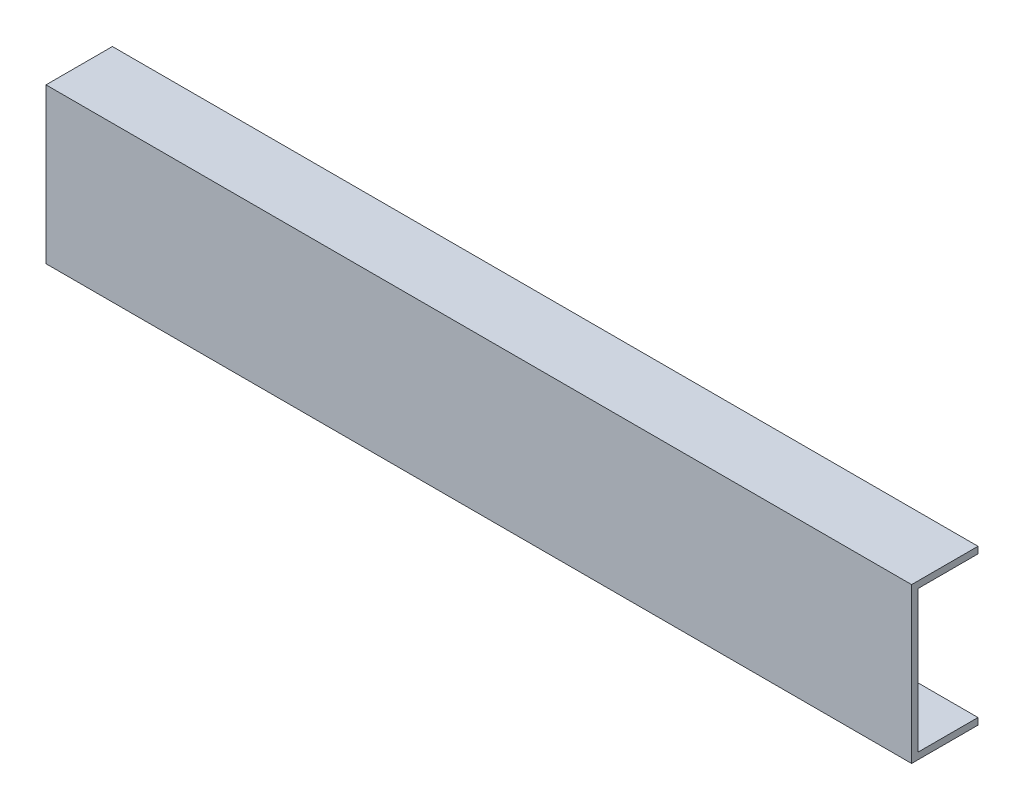
ISO-10303-21;
HEADER;
FILE_DESCRIPTION(('STEP AP214'),'2;1');
FILE_NAME('part.step','',(''),(''),'','','');
FILE_SCHEMA(('AUTOMOTIVE_DESIGN { 1 0 10303 214 1 1 1 1 }'));
ENDSEC;
DATA;
#1=APPLICATION_CONTEXT('core data for automotive mechanical design processes');
#2=APPLICATION_PROTOCOL_DEFINITION('international standard','automotive_design',2000,#1);
#3=PRODUCT_CONTEXT('',#1,'mechanical');
#4=PRODUCT('Part','Part','',(#3));
#5=PRODUCT_RELATED_PRODUCT_CATEGORY('part','',(#4));
#6=PRODUCT_DEFINITION_FORMATION('','',#4);
#7=PRODUCT_DEFINITION_CONTEXT('part definition',#1,'design');
#8=PRODUCT_DEFINITION('design','',#6,#7);
#9=PRODUCT_DEFINITION_SHAPE('','',#8);
#10=(LENGTH_UNIT() NAMED_UNIT(*) SI_UNIT(.MILLI.,.METRE.));
#11=(NAMED_UNIT(*) PLANE_ANGLE_UNIT() SI_UNIT($,.RADIAN.));
#12=(NAMED_UNIT(*) SI_UNIT($,.STERADIAN.) SOLID_ANGLE_UNIT());
#13=UNCERTAINTY_MEASURE_WITH_UNIT(LENGTH_MEASURE(1.E-05),#10,'distance_accuracy_value','');
#14=(GEOMETRIC_REPRESENTATION_CONTEXT(3) GLOBAL_UNCERTAINTY_ASSIGNED_CONTEXT((#13)) GLOBAL_UNIT_ASSIGNED_CONTEXT((#10,
#11,#12)) REPRESENTATION_CONTEXT('',''));
#15=CARTESIAN_POINT('',(0.,0.,0.));
#16=DIRECTION('',(0.,0.,1.));
#17=DIRECTION('',(1.,0.,0.));
#18=AXIS2_PLACEMENT_3D('',#15,#16,#17);
#19=CARTESIAN_POINT('',(391.08,3.,0.));
#20=DIRECTION('',(0.,0.,1.));
#21=DIRECTION('',(1.,0.,0.));
#22=AXIS2_PLACEMENT_3D('',#19,#20,#21);
#23=PLANE('',#22);
#24=DIRECTION('',(0.,1.,0.));
#25=VECTOR('',#24,1.);
#26=CARTESIAN_POINT('',(0.,3.,0.));
#27=LINE('',#26,#25);
#28=CARTESIAN_POINT('',(0.,0.,0.));
#29=VERTEX_POINT('',#28);
#30=CARTESIAN_POINT('',(0.,3.,0.));
#31=VERTEX_POINT('',#30);
#32=EDGE_CURVE('E130',#29,#31,#27,.T.);
#33=ORIENTED_EDGE('',*,*,#32,.T.);
#34=DIRECTION('',(-1.,0.,0.));
#35=VECTOR('',#34,1.);
#36=CARTESIAN_POINT('',(391.08,3.,0.));
#37=LINE('',#36,#35);
#38=CARTESIAN_POINT('',(391.08,3.,0.));
#39=VERTEX_POINT('',#38);
#40=EDGE_CURVE('E11',#39,#31,#37,.T.);
#41=ORIENTED_EDGE('',*,*,#40,.F.);
#42=DIRECTION('',(0.,1.,0.));
#43=VECTOR('',#42,1.);
#44=CARTESIAN_POINT('',(391.08,3.,0.));
#45=LINE('',#44,#43);
#46=CARTESIAN_POINT('',(391.08,0.,0.));
#47=VERTEX_POINT('',#46);
#48=EDGE_CURVE('E144',#47,#39,#45,.T.);
#49=ORIENTED_EDGE('',*,*,#48,.F.);
#50=DIRECTION('',(-1.,0.,0.));
#51=VECTOR('',#50,1.);
#52=CARTESIAN_POINT('',(391.08,0.,0.));
#53=LINE('',#52,#51);
#54=EDGE_CURVE('E126',#47,#29,#53,.T.);
#55=ORIENTED_EDGE('',*,*,#54,.T.);
#56=EDGE_LOOP('',(#33,#41,#49,#55));
#57=FACE_BOUND('',#56,.T.);
#58=ADVANCED_FACE('F34',(#57),#23,.F.);
#59=CARTESIAN_POINT('',(391.08,3.,0.));
#60=DIRECTION('',(0.,-1.,0.));
#61=DIRECTION('',(0.,0.,-1.));
#62=AXIS2_PLACEMENT_3D('',#59,#60,#61);
#63=PLANE('',#62);
#64=DIRECTION('',(0.,0.,1.));
#65=VECTOR('',#64,1.);
#66=CARTESIAN_POINT('',(0.,3.,0.));
#67=LINE('',#66,#65);
#68=CARTESIAN_POINT('',(0.,3.,27.));
#69=VERTEX_POINT('',#68);
#70=EDGE_CURVE('E133',#31,#69,#67,.T.);
#71=ORIENTED_EDGE('',*,*,#70,.T.);
#72=DIRECTION('',(-1.,0.,0.));
#73=VECTOR('',#72,1.);
#74=CARTESIAN_POINT('',(391.08,3.,27.));
#75=LINE('',#74,#73);
#76=CARTESIAN_POINT('',(391.08,3.,27.));
#77=VERTEX_POINT('',#76);
#78=EDGE_CURVE('E42',#77,#69,#75,.T.);
#79=ORIENTED_EDGE('',*,*,#78,.F.);
#80=DIRECTION('',(0.,0.,1.));
#81=VECTOR('',#80,1.);
#82=CARTESIAN_POINT('',(391.08,3.,0.));
#83=LINE('',#82,#81);
#84=EDGE_CURVE('E93',#39,#77,#83,.T.);
#85=ORIENTED_EDGE('',*,*,#84,.F.);
#86=ORIENTED_EDGE('',*,*,#40,.T.);
#87=EDGE_LOOP('',(#71,#79,#85,#86));
#88=FACE_BOUND('',#87,.T.);
#89=ADVANCED_FACE('F179',(#88),#63,.F.);
#90=CARTESIAN_POINT('',(391.08,3.,27.));
#91=DIRECTION('',(0.,0.,1.));
#92=DIRECTION('',(1.,0.,0.));
#93=AXIS2_PLACEMENT_3D('',#90,#91,#92);
#94=PLANE('',#93);
#95=DIRECTION('',(0.,1.,0.));
#96=VECTOR('',#95,1.);
#97=CARTESIAN_POINT('',(0.,3.,27.));
#98=LINE('',#97,#96);
#99=CARTESIAN_POINT('',(0.,67.,27.));
#100=VERTEX_POINT('',#99);
#101=EDGE_CURVE('E135',#69,#100,#98,.T.);
#102=ORIENTED_EDGE('',*,*,#101,.T.);
#103=DIRECTION('',(-1.,0.,0.));
#104=VECTOR('',#103,1.);
#105=CARTESIAN_POINT('',(391.08,67.,27.));
#106=LINE('',#105,#104);
#107=CARTESIAN_POINT('',(391.08,67.,27.));
#108=VERTEX_POINT('',#107);
#109=EDGE_CURVE('E151',#108,#100,#106,.T.);
#110=ORIENTED_EDGE('',*,*,#109,.F.);
#111=DIRECTION('',(0.,1.,0.));
#112=VECTOR('',#111,1.);
#113=CARTESIAN_POINT('',(391.08,3.,27.));
#114=LINE('',#113,#112);
#115=EDGE_CURVE('E159',#77,#108,#114,.T.);
#116=ORIENTED_EDGE('',*,*,#115,.F.);
#117=ORIENTED_EDGE('',*,*,#78,.T.);
#118=EDGE_LOOP('',(#102,#110,#116,#117));
#119=FACE_BOUND('',#118,.T.);
#120=ADVANCED_FACE('F157',(#119),#94,.F.);
#121=CARTESIAN_POINT('',(391.08,67.,27.));
#122=DIRECTION('',(0.,1.,0.));
#123=DIRECTION('',(0.,0.,1.));
#124=AXIS2_PLACEMENT_3D('',#121,#122,#123);
#125=PLANE('',#124);
#126=DIRECTION('',(0.,0.,-1.));
#127=VECTOR('',#126,1.);
#128=CARTESIAN_POINT('',(0.,67.,27.));
#129=LINE('',#128,#127);
#130=CARTESIAN_POINT('',(0.,67.,0.));
#131=VERTEX_POINT('',#130);
#132=EDGE_CURVE('E137',#100,#131,#129,.T.);
#133=ORIENTED_EDGE('',*,*,#132,.T.);
#134=DIRECTION('',(-1.,0.,0.));
#135=VECTOR('',#134,1.);
#136=CARTESIAN_POINT('',(391.08,67.,0.));
#137=LINE('',#136,#135);
#138=CARTESIAN_POINT('',(391.08,67.,0.));
#139=VERTEX_POINT('',#138);
#140=EDGE_CURVE('E148',#139,#131,#137,.T.);
#141=ORIENTED_EDGE('',*,*,#140,.F.);
#142=DIRECTION('',(0.,0.,-1.));
#143=VECTOR('',#142,1.);
#144=CARTESIAN_POINT('',(391.08,67.,27.));
#145=LINE('',#144,#143);
#146=EDGE_CURVE('E171',#108,#139,#145,.T.);
#147=ORIENTED_EDGE('',*,*,#146,.F.);
#148=ORIENTED_EDGE('',*,*,#109,.T.);
#149=EDGE_LOOP('',(#133,#141,#147,#148));
#150=FACE_BOUND('',#149,.T.);
#151=ADVANCED_FACE('F167',(#150),#125,.F.);
#152=CARTESIAN_POINT('',(391.08,70.,0.));
#153=DIRECTION('',(0.,0.,1.));
#154=DIRECTION('',(1.,0.,0.));
#155=AXIS2_PLACEMENT_3D('',#152,#153,#154);
#156=PLANE('',#155);
#157=DIRECTION('',(0.,1.,0.));
#158=VECTOR('',#157,1.);
#159=CARTESIAN_POINT('',(0.,70.,0.));
#160=LINE('',#159,#158);
#161=CARTESIAN_POINT('',(0.,70.,0.));
#162=VERTEX_POINT('',#161);
#163=EDGE_CURVE('E139',#131,#162,#160,.T.);
#164=ORIENTED_EDGE('',*,*,#163,.T.);
#165=DIRECTION('',(-1.,0.,0.));
#166=VECTOR('',#165,1.);
#167=CARTESIAN_POINT('',(391.08,70.,0.));
#168=LINE('',#167,#166);
#169=CARTESIAN_POINT('',(391.08,70.,0.));
#170=VERTEX_POINT('',#169);
#171=EDGE_CURVE('E121',#170,#162,#168,.T.);
#172=ORIENTED_EDGE('',*,*,#171,.F.);
#173=DIRECTION('',(0.,1.,0.));
#174=VECTOR('',#173,1.);
#175=CARTESIAN_POINT('',(391.08,70.,0.));
#176=LINE('',#175,#174);
#177=EDGE_CURVE('E112',#139,#170,#176,.T.);
#178=ORIENTED_EDGE('',*,*,#177,.F.);
#179=ORIENTED_EDGE('',*,*,#140,.T.);
#180=EDGE_LOOP('',(#164,#172,#178,#179));
#181=FACE_BOUND('',#180,.T.);
#182=ADVANCED_FACE('F170',(#181),#156,.F.);
#183=CARTESIAN_POINT('',(391.08,70.,30.));
#184=DIRECTION('',(0.,-1.,0.));
#185=DIRECTION('',(0.,0.,-1.));
#186=AXIS2_PLACEMENT_3D('',#183,#184,#185);
#187=PLANE('',#186);
#188=DIRECTION('',(0.,0.,1.));
#189=VECTOR('',#188,1.);
#190=CARTESIAN_POINT('',(0.,70.,30.));
#191=LINE('',#190,#189);
#192=CARTESIAN_POINT('',(0.,70.,30.));
#193=VERTEX_POINT('',#192);
#194=EDGE_CURVE('E120',#162,#193,#191,.T.);
#195=ORIENTED_EDGE('',*,*,#194,.T.);
#196=DIRECTION('',(-1.,0.,0.));
#197=VECTOR('',#196,1.);
#198=CARTESIAN_POINT('',(391.08,70.,30.));
#199=LINE('',#198,#197);
#200=CARTESIAN_POINT('',(391.08,70.,30.));
#201=VERTEX_POINT('',#200);
#202=EDGE_CURVE('E117',#201,#193,#199,.T.);
#203=ORIENTED_EDGE('',*,*,#202,.F.);
#204=DIRECTION('',(0.,0.,1.));
#205=VECTOR('',#204,1.);
#206=CARTESIAN_POINT('',(391.08,70.,30.));
#207=LINE('',#206,#205);
#208=EDGE_CURVE('E106',#170,#201,#207,.T.);
#209=ORIENTED_EDGE('',*,*,#208,.F.);
#210=ORIENTED_EDGE('',*,*,#171,.T.);
#211=EDGE_LOOP('',(#195,#203,#209,#210));
#212=FACE_BOUND('',#211,.T.);
#213=ADVANCED_FACE('F118',(#212),#187,.F.);
#214=CARTESIAN_POINT('',(391.08,0.,30.));
#215=DIRECTION('',(0.,0.,-1.));
#216=DIRECTION('',(-1.,0.,0.));
#217=AXIS2_PLACEMENT_3D('',#214,#215,#216);
#218=PLANE('',#217);
#219=DIRECTION('',(0.,-1.,0.));
#220=VECTOR('',#219,1.);
#221=CARTESIAN_POINT('',(0.,0.,30.));
#222=LINE('',#221,#220);
#223=CARTESIAN_POINT('',(0.,0.,30.));
#224=VERTEX_POINT('',#223);
#225=EDGE_CURVE('E79',#193,#224,#222,.T.);
#226=ORIENTED_EDGE('',*,*,#225,.T.);
#227=DIRECTION('',(-1.,0.,0.));
#228=VECTOR('',#227,1.);
#229=CARTESIAN_POINT('',(391.08,0.,30.));
#230=LINE('',#229,#228);
#231=CARTESIAN_POINT('',(391.08,0.,30.));
#232=VERTEX_POINT('',#231);
#233=EDGE_CURVE('E122',#232,#224,#230,.T.);
#234=ORIENTED_EDGE('',*,*,#233,.F.);
#235=DIRECTION('',(0.,-1.,0.));
#236=VECTOR('',#235,1.);
#237=CARTESIAN_POINT('',(391.08,0.,30.));
#238=LINE('',#237,#236);
#239=EDGE_CURVE('E110',#201,#232,#238,.T.);
#240=ORIENTED_EDGE('',*,*,#239,.F.);
#241=ORIENTED_EDGE('',*,*,#202,.T.);
#242=EDGE_LOOP('',(#226,#234,#240,#241));
#243=FACE_BOUND('',#242,.T.);
#244=ADVANCED_FACE('F124',(#243),#218,.F.);
#245=CARTESIAN_POINT('',(391.08,0.,0.));
#246=DIRECTION('',(0.,1.,0.));
#247=DIRECTION('',(0.,0.,1.));
#248=AXIS2_PLACEMENT_3D('',#245,#246,#247);
#249=PLANE('',#248);
#250=DIRECTION('',(0.,0.,-1.));
#251=VECTOR('',#250,1.);
#252=CARTESIAN_POINT('',(0.,0.,0.));
#253=LINE('',#252,#251);
#254=EDGE_CURVE('E85',#224,#29,#253,.T.);
#255=ORIENTED_EDGE('',*,*,#254,.T.);
#256=ORIENTED_EDGE('',*,*,#54,.F.);
#257=DIRECTION('',(0.,0.,-1.));
#258=VECTOR('',#257,1.);
#259=CARTESIAN_POINT('',(391.08,0.,0.));
#260=LINE('',#259,#258);
#261=EDGE_CURVE('E50',#232,#47,#260,.T.);
#262=ORIENTED_EDGE('',*,*,#261,.F.);
#263=ORIENTED_EDGE('',*,*,#233,.T.);
#264=EDGE_LOOP('',(#255,#256,#262,#263));
#265=FACE_BOUND('',#264,.T.);
#266=ADVANCED_FACE('F195',(#265),#249,.F.);
#267=CARTESIAN_POINT('',(391.08,0.,0.));
#268=DIRECTION('',(-1.,0.,0.));
#269=DIRECTION('',(0.,0.,1.));
#270=AXIS2_PLACEMENT_3D('',#267,#268,#269);
#271=PLANE('',#270);
#272=ORIENTED_EDGE('',*,*,#48,.T.);
#273=ORIENTED_EDGE('',*,*,#84,.T.);
#274=ORIENTED_EDGE('',*,*,#115,.T.);
#275=ORIENTED_EDGE('',*,*,#146,.T.);
#276=ORIENTED_EDGE('',*,*,#177,.T.);
#277=ORIENTED_EDGE('',*,*,#208,.T.);
#278=ORIENTED_EDGE('',*,*,#239,.T.);
#279=ORIENTED_EDGE('',*,*,#261,.T.);
#280=EDGE_LOOP('',(#272,#273,#274,#275,#276,#277,#278,#279));
#281=FACE_BOUND('',#280,.T.);
#282=ADVANCED_FACE('F108',(#281),#271,.F.);
#283=CARTESIAN_POINT('',(0.,0.,0.));
#284=DIRECTION('',(-1.,0.,0.));
#285=DIRECTION('',(0.,0.,1.));
#286=AXIS2_PLACEMENT_3D('',#283,#284,#285);
#287=PLANE('',#286);
#288=ORIENTED_EDGE('',*,*,#32,.F.);
#289=ORIENTED_EDGE('',*,*,#254,.F.);
#290=ORIENTED_EDGE('',*,*,#225,.F.);
#291=ORIENTED_EDGE('',*,*,#194,.F.);
#292=ORIENTED_EDGE('',*,*,#163,.F.);
#293=ORIENTED_EDGE('',*,*,#132,.F.);
#294=ORIENTED_EDGE('',*,*,#101,.F.);
#295=ORIENTED_EDGE('',*,*,#70,.F.);
#296=EDGE_LOOP('',(#288,#289,#290,#291,#292,#293,#294,#295));
#297=FACE_BOUND('',#296,.T.);
#298=ADVANCED_FACE('F163',(#297),#287,.T.);
#299=CLOSED_SHELL('',(#58,#89,#120,#151,#182,#213,#244,#266,#282,#298));
#300=MANIFOLD_SOLID_BREP('B2',#299);
#301=ADVANCED_BREP_SHAPE_REPRESENTATION('',(#18,#300),#14);
#302=SHAPE_DEFINITION_REPRESENTATION(#9,#301);
ENDSEC;
END-ISO-10303-21;
